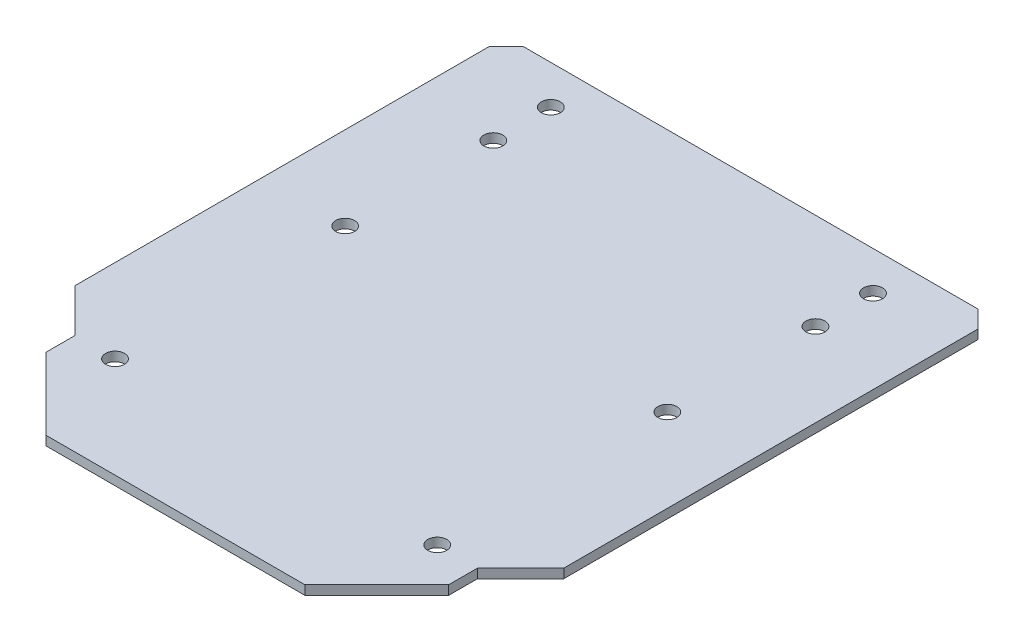
ISO-10303-21;
HEADER;
FILE_DESCRIPTION(('STEP AP214'),'2;1');
FILE_NAME('part.step','',(''),(''),'','','');
FILE_SCHEMA(('AUTOMOTIVE_DESIGN { 1 0 10303 214 1 1 1 1 }'));
ENDSEC;
DATA;
#1=APPLICATION_CONTEXT('core data for automotive mechanical design processes');
#2=APPLICATION_PROTOCOL_DEFINITION('international standard','automotive_design',2000,#1);
#3=PRODUCT_CONTEXT('',#1,'mechanical');
#4=PRODUCT('Part','Part','',(#3));
#5=PRODUCT_RELATED_PRODUCT_CATEGORY('part','',(#4));
#6=PRODUCT_DEFINITION_FORMATION('','',#4);
#7=PRODUCT_DEFINITION_CONTEXT('part definition',#1,'design');
#8=PRODUCT_DEFINITION('design','',#6,#7);
#9=PRODUCT_DEFINITION_SHAPE('','',#8);
#10=(LENGTH_UNIT() NAMED_UNIT(*) SI_UNIT(.MILLI.,.METRE.));
#11=(NAMED_UNIT(*) PLANE_ANGLE_UNIT() SI_UNIT($,.RADIAN.));
#12=(NAMED_UNIT(*) SI_UNIT($,.STERADIAN.) SOLID_ANGLE_UNIT());
#13=UNCERTAINTY_MEASURE_WITH_UNIT(LENGTH_MEASURE(1.E-05),#10,'distance_accuracy_value','');
#14=(GEOMETRIC_REPRESENTATION_CONTEXT(3) GLOBAL_UNCERTAINTY_ASSIGNED_CONTEXT((#13)) GLOBAL_UNIT_ASSIGNED_CONTEXT((#10,
#11,#12)) REPRESENTATION_CONTEXT('',''));
#15=CARTESIAN_POINT('',(0.,0.,0.));
#16=DIRECTION('',(0.,0.,1.));
#17=DIRECTION('',(1.,0.,0.));
#18=AXIS2_PLACEMENT_3D('',#15,#16,#17);
#19=CARTESIAN_POINT('',(42.5,1.6,37.5));
#20=DIRECTION('',(-1.,0.,0.));
#21=DIRECTION('',(0.,0.,1.));
#22=AXIS2_PLACEMENT_3D('',#19,#20,#21);
#23=PLANE('',#22);
#24=DIRECTION('',(0.,1.,0.));
#25=VECTOR('',#24,1.);
#26=CARTESIAN_POINT('',(42.5,-0.000999999999999916,12.4999999999999));
#27=LINE('',#26,#25);
#28=CARTESIAN_POINT('',(42.5,0.,12.4999999999999));
#29=VERTEX_POINT('',#28);
#30=CARTESIAN_POINT('',(42.5,1.6,12.4999999999999));
#31=VERTEX_POINT('',#30);
#32=EDGE_CURVE('E125',#29,#31,#27,.T.);
#33=ORIENTED_EDGE('',*,*,#32,.F.);
#34=DIRECTION('',(0.,0.,-1.));
#35=VECTOR('',#34,1.);
#36=CARTESIAN_POINT('',(42.5,0.,37.5));
#37=LINE('',#36,#35);
#38=CARTESIAN_POINT('',(42.5,0.,-59.5));
#39=VERTEX_POINT('',#38);
#40=EDGE_CURVE('E161',#29,#39,#37,.T.);
#41=ORIENTED_EDGE('',*,*,#40,.T.);
#42=DIRECTION('',(0.,1.,0.));
#43=VECTOR('',#42,1.);
#44=CARTESIAN_POINT('',(42.5,1.6,-59.5));
#45=LINE('',#44,#43);
#46=CARTESIAN_POINT('',(42.5,1.6,-59.5));
#47=VERTEX_POINT('',#46);
#48=EDGE_CURVE('E143',#39,#47,#45,.T.);
#49=ORIENTED_EDGE('',*,*,#48,.T.);
#50=DIRECTION('',(0.,0.,-1.));
#51=VECTOR('',#50,1.);
#52=CARTESIAN_POINT('',(42.5,1.6,37.5));
#53=LINE('',#52,#51);
#54=EDGE_CURVE('E138',#31,#47,#53,.T.);
#55=ORIENTED_EDGE('',*,*,#54,.F.);
#56=EDGE_LOOP('',(#33,#41,#49,#55));
#57=FACE_BOUND('',#56,.T.);
#58=ADVANCED_FACE('F35',(#57),#23,.F.);
#59=CARTESIAN_POINT('',(0.,1.6,0.));
#60=DIRECTION('',(0.,-1.,0.));
#61=DIRECTION('',(0.,0.,-1.));
#62=AXIS2_PLACEMENT_3D('',#59,#60,#61);
#63=PLANE('',#62);
#64=CARTESIAN_POINT('',(-28.,1.6,-45.75));
#65=DIRECTION('',(0.,1.,0.));
#66=DIRECTION('',(0.,0.,1.));
#67=AXIS2_PLACEMENT_3D('',#64,#65,#66);
#68=CIRCLE('',#67,1.65);
#69=CARTESIAN_POINT('',(-28.,1.6,-44.1));
#70=VERTEX_POINT('',#69);
#71=EDGE_CURVE('E383',#70,#70,#68,.T.);
#72=ORIENTED_EDGE('',*,*,#71,.F.);
#73=EDGE_LOOP('',(#72));
#74=FACE_BOUND('',#73,.T.);
#75=CARTESIAN_POINT('',(28.,1.6,-55.75));
#76=DIRECTION('',(0.,1.,0.));
#77=DIRECTION('',(0.,0.,1.));
#78=AXIS2_PLACEMENT_3D('',#75,#76,#77);
#79=CIRCLE('',#78,1.65);
#80=CARTESIAN_POINT('',(28.,1.6,-54.1));
#81=VERTEX_POINT('',#80);
#82=EDGE_CURVE('E379',#81,#81,#79,.T.);
#83=ORIENTED_EDGE('',*,*,#82,.F.);
#84=EDGE_LOOP('',(#83));
#85=FACE_BOUND('',#84,.T.);
#86=CARTESIAN_POINT('',(28.,1.6,-45.75));
#87=DIRECTION('',(0.,1.,0.));
#88=DIRECTION('',(0.,0.,1.));
#89=AXIS2_PLACEMENT_3D('',#86,#87,#88);
#90=CIRCLE('',#89,1.65);
#91=CARTESIAN_POINT('',(28.,1.6,-44.1));
#92=VERTEX_POINT('',#91);
#93=EDGE_CURVE('E376',#92,#92,#90,.T.);
#94=ORIENTED_EDGE('',*,*,#93,.F.);
#95=EDGE_LOOP('',(#94));
#96=FACE_BOUND('',#95,.T.);
#97=CARTESIAN_POINT('',(-28.,1.6,-55.75));
#98=DIRECTION('',(0.,1.,0.));
#99=DIRECTION('',(0.,0.,1.));
#100=AXIS2_PLACEMENT_3D('',#97,#98,#99);
#101=CIRCLE('',#100,1.65);
#102=CARTESIAN_POINT('',(-28.,1.6,-54.1));
#103=VERTEX_POINT('',#102);
#104=EDGE_CURVE('E389',#103,#103,#101,.T.);
#105=ORIENTED_EDGE('',*,*,#104,.F.);
#106=EDGE_LOOP('',(#105));
#107=FACE_BOUND('',#106,.T.);
#108=CARTESIAN_POINT('',(-28.,1.6,-20.));
#109=DIRECTION('',(0.,1.,0.));
#110=DIRECTION('',(0.,0.,1.));
#111=AXIS2_PLACEMENT_3D('',#108,#109,#110);
#112=CIRCLE('',#111,1.65);
#113=CARTESIAN_POINT('',(-28.,1.6,-18.35));
#114=VERTEX_POINT('',#113);
#115=EDGE_CURVE('E163',#114,#114,#112,.T.);
#116=ORIENTED_EDGE('',*,*,#115,.F.);
#117=EDGE_LOOP('',(#116));
#118=FACE_BOUND('',#117,.T.);
#119=CARTESIAN_POINT('',(28.,1.6,20.));
#120=DIRECTION('',(0.,1.,0.));
#121=DIRECTION('',(0.,0.,1.));
#122=AXIS2_PLACEMENT_3D('',#119,#120,#121);
#123=CIRCLE('',#122,1.65);
#124=CARTESIAN_POINT('',(28.,1.6,21.65));
#125=VERTEX_POINT('',#124);
#126=EDGE_CURVE('E238',#125,#125,#123,.T.);
#127=ORIENTED_EDGE('',*,*,#126,.F.);
#128=EDGE_LOOP('',(#127));
#129=FACE_BOUND('',#128,.T.);
#130=CARTESIAN_POINT('',(28.,1.6,-20.));
#131=DIRECTION('',(0.,1.,0.));
#132=DIRECTION('',(0.,0.,1.));
#133=AXIS2_PLACEMENT_3D('',#130,#131,#132);
#134=CIRCLE('',#133,1.65);
#135=CARTESIAN_POINT('',(28.,1.6,-18.35));
#136=VERTEX_POINT('',#135);
#137=EDGE_CURVE('E250',#136,#136,#134,.T.);
#138=ORIENTED_EDGE('',*,*,#137,.F.);
#139=EDGE_LOOP('',(#138));
#140=FACE_BOUND('',#139,.T.);
#141=CARTESIAN_POINT('',(-28.,1.6,20.));
#142=DIRECTION('',(0.,1.,0.));
#143=DIRECTION('',(0.,0.,1.));
#144=AXIS2_PLACEMENT_3D('',#141,#142,#143);
#145=CIRCLE('',#144,1.65);
#146=CARTESIAN_POINT('',(-28.,1.6,21.65));
#147=VERTEX_POINT('',#146);
#148=EDGE_CURVE('E244',#147,#147,#145,.T.);
#149=ORIENTED_EDGE('',*,*,#148,.F.);
#150=EDGE_LOOP('',(#149));
#151=FACE_BOUND('',#150,.T.);
#152=DIRECTION('',(0.,0.,-1.));
#153=VECTOR('',#152,1.);
#154=CARTESIAN_POINT('',(35.,1.6,24.9999999999999));
#155=LINE('',#154,#153);
#156=CARTESIAN_POINT('',(35.0000000000001,1.6,24.9999999999999));
#157=VERTEX_POINT('',#156);
#158=CARTESIAN_POINT('',(35.,1.6,19.9999999999999));
#159=VERTEX_POINT('',#158);
#160=EDGE_CURVE('E50',#157,#159,#155,.T.);
#161=ORIENTED_EDGE('',*,*,#160,.T.);
#162=DIRECTION('',(0.707106781186547,0.,-0.707106781186548));
#163=VECTOR('',#162,1.);
#164=CARTESIAN_POINT('',(35.,1.6,19.9999999999999));
#165=LINE('',#164,#163);
#166=EDGE_CURVE('E128',#159,#31,#165,.T.);
#167=ORIENTED_EDGE('',*,*,#166,.T.);
#168=ORIENTED_EDGE('',*,*,#54,.T.);
#169=DIRECTION('',(0.707106781186545,0.,0.70710678118655));
#170=VECTOR('',#169,1.);
#171=CARTESIAN_POINT('',(39.5,1.6,-62.5));
#172=LINE('',#171,#170);
#173=CARTESIAN_POINT('',(39.5,1.6,-62.5));
#174=VERTEX_POINT('',#173);
#175=EDGE_CURVE('E178',#47,#174,#172,.F.);
#176=ORIENTED_EDGE('',*,*,#175,.T.);
#177=DIRECTION('',(1.,0.,0.));
#178=VECTOR('',#177,1.);
#179=CARTESIAN_POINT('',(-42.5,1.6,-62.5));
#180=LINE('',#179,#178);
#181=CARTESIAN_POINT('',(-39.4999999999999,1.6,-62.5));
#182=VERTEX_POINT('',#181);
#183=EDGE_CURVE('E234',#182,#174,#180,.T.);
#184=ORIENTED_EDGE('',*,*,#183,.F.);
#185=DIRECTION('',(0.70710678118655,0.,-0.707106781186545));
#186=VECTOR('',#185,1.);
#187=CARTESIAN_POINT('',(-42.5,1.6,-59.5));
#188=LINE('',#187,#186);
#189=CARTESIAN_POINT('',(-42.5,1.6,-59.5));
#190=VERTEX_POINT('',#189);
#191=EDGE_CURVE('E176',#182,#190,#188,.F.);
#192=ORIENTED_EDGE('',*,*,#191,.T.);
#193=DIRECTION('',(0.,0.,1.));
#194=VECTOR('',#193,1.);
#195=CARTESIAN_POINT('',(-42.5,1.6,37.5));
#196=LINE('',#195,#194);
#197=CARTESIAN_POINT('',(-42.5,1.6,12.4999999999999));
#198=VERTEX_POINT('',#197);
#199=EDGE_CURVE('E145',#190,#198,#196,.T.);
#200=ORIENTED_EDGE('',*,*,#199,.T.);
#201=DIRECTION('',(-0.707106781186547,0.,-0.707106781186548));
#202=VECTOR('',#201,1.);
#203=CARTESIAN_POINT('',(-35.,1.6,19.9999999999999));
#204=LINE('',#203,#202);
#205=CARTESIAN_POINT('',(-35.,1.6,19.9999999999999));
#206=VERTEX_POINT('',#205);
#207=EDGE_CURVE('E222',#206,#198,#204,.T.);
#208=ORIENTED_EDGE('',*,*,#207,.F.);
#209=DIRECTION('',(0.,0.,-1.));
#210=VECTOR('',#209,1.);
#211=CARTESIAN_POINT('',(-35.,1.6,24.9999999999999));
#212=LINE('',#211,#210);
#213=CARTESIAN_POINT('',(-35.,1.6,24.9999999999999));
#214=VERTEX_POINT('',#213);
#215=EDGE_CURVE('E198',#214,#206,#212,.T.);
#216=ORIENTED_EDGE('',*,*,#215,.F.);
#217=DIRECTION('',(-0.707106781186547,0.,-0.707106781186548));
#218=VECTOR('',#217,1.);
#219=CARTESIAN_POINT('',(-22.5,1.6,37.5));
#220=LINE('',#219,#218);
#221=CARTESIAN_POINT('',(-22.5,1.6,37.5));
#222=VERTEX_POINT('',#221);
#223=EDGE_CURVE('E43',#214,#222,#220,.F.);
#224=ORIENTED_EDGE('',*,*,#223,.T.);
#225=DIRECTION('',(1.,0.,0.));
#226=VECTOR('',#225,1.);
#227=CARTESIAN_POINT('',(-42.5,1.6,37.5));
#228=LINE('',#227,#226);
#229=CARTESIAN_POINT('',(22.5,1.6,37.5));
#230=VERTEX_POINT('',#229);
#231=EDGE_CURVE('E149',#222,#230,#228,.T.);
#232=ORIENTED_EDGE('',*,*,#231,.T.);
#233=DIRECTION('',(-0.707106781186549,0.,0.707106781186547));
#234=VECTOR('',#233,1.);
#235=CARTESIAN_POINT('',(42.5,1.6,17.5));
#236=LINE('',#235,#234);
#237=EDGE_CURVE('E11',#230,#157,#236,.F.);
#238=ORIENTED_EDGE('',*,*,#237,.T.);
#239=EDGE_LOOP('',(#161,#167,#168,#176,#184,#192,#200,#208,#216,#224,#232,#238));
#240=FACE_BOUND('',#239,.T.);
#241=ADVANCED_FACE('F137',(#74,#85,#96,#107,#118,#129,#140,#151,#240),#63,.F.);
#242=CARTESIAN_POINT('',(0.,0.,0.));
#243=DIRECTION('',(0.,-1.,0.));
#244=DIRECTION('',(0.,0.,-1.));
#245=AXIS2_PLACEMENT_3D('',#242,#243,#244);
#246=PLANE('',#245);
#247=CARTESIAN_POINT('',(-28.,0.,-45.75));
#248=DIRECTION('',(0.,-1.,0.));
#249=DIRECTION('',(0.,0.,-1.));
#250=AXIS2_PLACEMENT_3D('',#247,#248,#249);
#251=CIRCLE('',#250,1.65);
#252=CARTESIAN_POINT('',(-28.,0.,-47.4));
#253=VERTEX_POINT('',#252);
#254=EDGE_CURVE('E306',#253,#253,#251,.F.);
#255=ORIENTED_EDGE('',*,*,#254,.T.);
#256=EDGE_LOOP('',(#255));
#257=FACE_BOUND('',#256,.T.);
#258=CARTESIAN_POINT('',(28.,0.,-55.75));
#259=DIRECTION('',(0.,-1.,0.));
#260=DIRECTION('',(0.,0.,-1.));
#261=AXIS2_PLACEMENT_3D('',#258,#259,#260);
#262=CIRCLE('',#261,1.65);
#263=CARTESIAN_POINT('',(28.,0.,-57.4));
#264=VERTEX_POINT('',#263);
#265=EDGE_CURVE('E310',#264,#264,#262,.F.);
#266=ORIENTED_EDGE('',*,*,#265,.T.);
#267=EDGE_LOOP('',(#266));
#268=FACE_BOUND('',#267,.T.);
#269=CARTESIAN_POINT('',(28.,0.,-45.75));
#270=DIRECTION('',(0.,-1.,0.));
#271=DIRECTION('',(0.,0.,-1.));
#272=AXIS2_PLACEMENT_3D('',#269,#270,#271);
#273=CIRCLE('',#272,1.65);
#274=CARTESIAN_POINT('',(28.,0.,-47.4));
#275=VERTEX_POINT('',#274);
#276=EDGE_CURVE('E314',#275,#275,#273,.F.);
#277=ORIENTED_EDGE('',*,*,#276,.T.);
#278=EDGE_LOOP('',(#277));
#279=FACE_BOUND('',#278,.T.);
#280=CARTESIAN_POINT('',(-28.,0.,-55.75));
#281=DIRECTION('',(0.,-1.,0.));
#282=DIRECTION('',(0.,0.,-1.));
#283=AXIS2_PLACEMENT_3D('',#280,#281,#282);
#284=CIRCLE('',#283,1.65);
#285=CARTESIAN_POINT('',(-28.,0.,-57.4));
#286=VERTEX_POINT('',#285);
#287=EDGE_CURVE('E318',#286,#286,#284,.F.);
#288=ORIENTED_EDGE('',*,*,#287,.T.);
#289=EDGE_LOOP('',(#288));
#290=FACE_BOUND('',#289,.T.);
#291=CARTESIAN_POINT('',(-28.,0.,20.));
#292=DIRECTION('',(0.,-1.,0.));
#293=DIRECTION('',(0.,0.,-1.));
#294=AXIS2_PLACEMENT_3D('',#291,#292,#293);
#295=CIRCLE('',#294,1.65);
#296=CARTESIAN_POINT('',(-28.,0.,18.35));
#297=VERTEX_POINT('',#296);
#298=EDGE_CURVE('E247',#297,#297,#295,.F.);
#299=ORIENTED_EDGE('',*,*,#298,.T.);
#300=EDGE_LOOP('',(#299));
#301=FACE_BOUND('',#300,.T.);
#302=CARTESIAN_POINT('',(28.,0.,-20.));
#303=DIRECTION('',(0.,-1.,0.));
#304=DIRECTION('',(0.,0.,-1.));
#305=AXIS2_PLACEMENT_3D('',#302,#303,#304);
#306=CIRCLE('',#305,1.65);
#307=CARTESIAN_POINT('',(28.,0.,-21.65));
#308=VERTEX_POINT('',#307);
#309=EDGE_CURVE('E241',#308,#308,#306,.F.);
#310=ORIENTED_EDGE('',*,*,#309,.T.);
#311=EDGE_LOOP('',(#310));
#312=FACE_BOUND('',#311,.T.);
#313=CARTESIAN_POINT('',(28.,0.,20.));
#314=DIRECTION('',(0.,-1.,0.));
#315=DIRECTION('',(0.,0.,-1.));
#316=AXIS2_PLACEMENT_3D('',#313,#314,#315);
#317=CIRCLE('',#316,1.65);
#318=CARTESIAN_POINT('',(28.,0.,18.35));
#319=VERTEX_POINT('',#318);
#320=EDGE_CURVE('E237',#319,#319,#317,.F.);
#321=ORIENTED_EDGE('',*,*,#320,.T.);
#322=EDGE_LOOP('',(#321));
#323=FACE_BOUND('',#322,.T.);
#324=CARTESIAN_POINT('',(-28.,0.,-20.));
#325=DIRECTION('',(0.,-1.,0.));
#326=DIRECTION('',(0.,0.,-1.));
#327=AXIS2_PLACEMENT_3D('',#324,#325,#326);
#328=CIRCLE('',#327,1.65);
#329=CARTESIAN_POINT('',(-28.,0.,-21.65));
#330=VERTEX_POINT('',#329);
#331=EDGE_CURVE('E155',#330,#330,#328,.F.);
#332=ORIENTED_EDGE('',*,*,#331,.T.);
#333=EDGE_LOOP('',(#332));
#334=FACE_BOUND('',#333,.T.);
#335=DIRECTION('',(0.707106781186547,0.,-0.707106781186548));
#336=VECTOR('',#335,1.);
#337=CARTESIAN_POINT('',(35.,0.,19.9999999999999));
#338=LINE('',#337,#336);
#339=CARTESIAN_POINT('',(35.,0.,19.9999999999999));
#340=VERTEX_POINT('',#339);
#341=EDGE_CURVE('E130',#340,#29,#338,.T.);
#342=ORIENTED_EDGE('',*,*,#341,.F.);
#343=DIRECTION('',(0.,0.,-1.));
#344=VECTOR('',#343,1.);
#345=CARTESIAN_POINT('',(35.,0.,24.9999999999999));
#346=LINE('',#345,#344);
#347=CARTESIAN_POINT('',(35.,0.,24.9999999999999));
#348=VERTEX_POINT('',#347);
#349=EDGE_CURVE('E140',#348,#340,#346,.T.);
#350=ORIENTED_EDGE('',*,*,#349,.F.);
#351=DIRECTION('',(0.707106781186549,0.,-0.707106781186547));
#352=VECTOR('',#351,1.);
#353=CARTESIAN_POINT('',(29.9999999999999,0.,30.));
#354=LINE('',#353,#352);
#355=CARTESIAN_POINT('',(22.5,0.,37.5));
#356=VERTEX_POINT('',#355);
#357=EDGE_CURVE('E186',#348,#356,#354,.F.);
#358=ORIENTED_EDGE('',*,*,#357,.T.);
#359=DIRECTION('',(1.,0.,0.));
#360=VECTOR('',#359,1.);
#361=CARTESIAN_POINT('',(-42.5,0.,37.5));
#362=LINE('',#361,#360);
#363=CARTESIAN_POINT('',(-22.5,0.,37.5));
#364=VERTEX_POINT('',#363);
#365=EDGE_CURVE('E146',#364,#356,#362,.T.);
#366=ORIENTED_EDGE('',*,*,#365,.F.);
#367=DIRECTION('',(0.707106781186547,0.,0.707106781186548));
#368=VECTOR('',#367,1.);
#369=CARTESIAN_POINT('',(-30.,0.,29.9999999999999));
#370=LINE('',#369,#368);
#371=CARTESIAN_POINT('',(-35.,0.,25.));
#372=VERTEX_POINT('',#371);
#373=EDGE_CURVE('E183',#364,#372,#370,.F.);
#374=ORIENTED_EDGE('',*,*,#373,.T.);
#375=DIRECTION('',(0.,0.,-1.));
#376=VECTOR('',#375,1.);
#377=CARTESIAN_POINT('',(-35.,0.,24.9999999999999));
#378=LINE('',#377,#376);
#379=CARTESIAN_POINT('',(-35.,0.,19.9999999999999));
#380=VERTEX_POINT('',#379);
#381=EDGE_CURVE('E58',#372,#380,#378,.T.);
#382=ORIENTED_EDGE('',*,*,#381,.T.);
#383=DIRECTION('',(-0.707106781186547,0.,-0.707106781186548));
#384=VECTOR('',#383,1.);
#385=CARTESIAN_POINT('',(-35.,0.,19.9999999999999));
#386=LINE('',#385,#384);
#387=CARTESIAN_POINT('',(-42.5,0.,12.4999999999999));
#388=VERTEX_POINT('',#387);
#389=EDGE_CURVE('E215',#380,#388,#386,.T.);
#390=ORIENTED_EDGE('',*,*,#389,.T.);
#391=DIRECTION('',(0.,0.,1.));
#392=VECTOR('',#391,1.);
#393=CARTESIAN_POINT('',(-42.5,0.,37.5));
#394=LINE('',#393,#392);
#395=CARTESIAN_POINT('',(-42.5,0.,-59.5));
#396=VERTEX_POINT('',#395);
#397=EDGE_CURVE('E152',#396,#388,#394,.T.);
#398=ORIENTED_EDGE('',*,*,#397,.F.);
#399=DIRECTION('',(-0.70710678118655,0.,0.707106781186545));
#400=VECTOR('',#399,1.);
#401=CARTESIAN_POINT('',(-50.9999999999998,0.,-51.0000000000002));
#402=LINE('',#401,#400);
#403=CARTESIAN_POINT('',(-39.4999999999999,0.,-62.5));
#404=VERTEX_POINT('',#403);
#405=EDGE_CURVE('E170',#396,#404,#402,.F.);
#406=ORIENTED_EDGE('',*,*,#405,.T.);
#407=DIRECTION('',(-1.,0.,0.));
#408=VECTOR('',#407,1.);
#409=CARTESIAN_POINT('',(-42.5,0.,-62.5));
#410=LINE('',#409,#408);
#411=CARTESIAN_POINT('',(39.5,0.,-62.5));
#412=VERTEX_POINT('',#411);
#413=EDGE_CURVE('E231',#412,#404,#410,.T.);
#414=ORIENTED_EDGE('',*,*,#413,.F.);
#415=DIRECTION('',(-0.707106781186545,0.,-0.70710678118655));
#416=VECTOR('',#415,1.);
#417=CARTESIAN_POINT('',(51.0000000000001,0.,-50.9999999999998));
#418=LINE('',#417,#416);
#419=EDGE_CURVE('E172',#412,#39,#418,.F.);
#420=ORIENTED_EDGE('',*,*,#419,.T.);
#421=ORIENTED_EDGE('',*,*,#40,.F.);
#422=EDGE_LOOP('',(#342,#350,#358,#366,#374,#382,#390,#398,#406,#414,#420,#421));
#423=FACE_BOUND('',#422,.T.);
#424=ADVANCED_FACE('F207',(#257,#268,#279,#290,#301,#312,#323,#334,#423),#246,.T.);
#425=CARTESIAN_POINT('',(42.5,1.6,17.5));
#426=DIRECTION('',(-0.707106781186547,0.,-0.707106781186549));
#427=DIRECTION('',(0.,-1.,0.));
#428=AXIS2_PLACEMENT_3D('',#425,#426,#427);
#429=PLANE('',#428);
#430=ORIENTED_EDGE('',*,*,#357,.F.);
#431=DIRECTION('',(0.,1.,0.));
#432=VECTOR('',#431,1.);
#433=CARTESIAN_POINT('',(35.,-0.000999999999999916,24.9999999999999));
#434=LINE('',#433,#432);
#435=EDGE_CURVE('E213',#348,#157,#434,.T.);
#436=ORIENTED_EDGE('',*,*,#435,.T.);
#437=ORIENTED_EDGE('',*,*,#237,.F.);
#438=DIRECTION('',(0.,1.,0.));
#439=VECTOR('',#438,1.);
#440=CARTESIAN_POINT('',(22.5,1.6,37.5));
#441=LINE('',#440,#439);
#442=EDGE_CURVE('E191',#356,#230,#441,.T.);
#443=ORIENTED_EDGE('',*,*,#442,.F.);
#444=EDGE_LOOP('',(#430,#436,#437,#443));
#445=FACE_BOUND('',#444,.T.);
#446=ADVANCED_FACE('F212',(#445),#429,.F.);
#447=CARTESIAN_POINT('',(-42.5,1.6,37.5));
#448=DIRECTION('',(1.,0.,0.));
#449=DIRECTION('',(0.,0.,-1.));
#450=AXIS2_PLACEMENT_3D('',#447,#448,#449);
#451=PLANE('',#450);
#452=ORIENTED_EDGE('',*,*,#397,.T.);
#453=DIRECTION('',(0.,1.,0.));
#454=VECTOR('',#453,1.);
#455=CARTESIAN_POINT('',(-42.5,-0.000999999999999916,12.4999999999999));
#456=LINE('',#455,#454);
#457=EDGE_CURVE('E224',#388,#198,#456,.T.);
#458=ORIENTED_EDGE('',*,*,#457,.T.);
#459=ORIENTED_EDGE('',*,*,#199,.F.);
#460=DIRECTION('',(0.,-1.,0.));
#461=VECTOR('',#460,1.);
#462=CARTESIAN_POINT('',(-42.5,1.6,-59.5));
#463=LINE('',#462,#461);
#464=EDGE_CURVE('E180',#190,#396,#463,.T.);
#465=ORIENTED_EDGE('',*,*,#464,.T.);
#466=EDGE_LOOP('',(#452,#458,#459,#465));
#467=FACE_BOUND('',#466,.T.);
#468=ADVANCED_FACE('F273',(#467),#451,.F.);
#469=CARTESIAN_POINT('',(-42.5,1.6,37.5));
#470=DIRECTION('',(0.,0.,-1.));
#471=DIRECTION('',(-1.,0.,0.));
#472=AXIS2_PLACEMENT_3D('',#469,#470,#471);
#473=PLANE('',#472);
#474=ORIENTED_EDGE('',*,*,#365,.T.);
#475=ORIENTED_EDGE('',*,*,#442,.T.);
#476=ORIENTED_EDGE('',*,*,#231,.F.);
#477=DIRECTION('',(0.,-1.,0.));
#478=VECTOR('',#477,1.);
#479=CARTESIAN_POINT('',(-22.5,1.6,37.5));
#480=LINE('',#479,#478);
#481=EDGE_CURVE('E188',#222,#364,#480,.T.);
#482=ORIENTED_EDGE('',*,*,#481,.T.);
#483=EDGE_LOOP('',(#474,#475,#476,#482));
#484=FACE_BOUND('',#483,.T.);
#485=ADVANCED_FACE('F202',(#484),#473,.F.);
#486=CARTESIAN_POINT('',(-28.,-0.000999999999999916,-20.));
#487=DIRECTION('',(0.,1.,0.));
#488=DIRECTION('',(0.,0.,1.));
#489=AXIS2_PLACEMENT_3D('',#486,#487,#488);
#490=CYLINDRICAL_SURFACE('',#489,1.65);
#491=ORIENTED_EDGE('',*,*,#331,.F.);
#492=EDGE_LOOP('',(#491));
#493=FACE_BOUND('',#492,.T.);
#494=ORIENTED_EDGE('',*,*,#115,.T.);
#495=EDGE_LOOP('',(#494));
#496=FACE_BOUND('',#495,.T.);
#497=ADVANCED_FACE('F261',(#493,#496),#490,.F.);
#498=CARTESIAN_POINT('',(28.,-0.000999999999999916,20.));
#499=DIRECTION('',(0.,1.,0.));
#500=DIRECTION('',(0.,0.,1.));
#501=AXIS2_PLACEMENT_3D('',#498,#499,#500);
#502=CYLINDRICAL_SURFACE('',#501,1.65);
#503=ORIENTED_EDGE('',*,*,#320,.F.);
#504=EDGE_LOOP('',(#503));
#505=FACE_BOUND('',#504,.T.);
#506=ORIENTED_EDGE('',*,*,#126,.T.);
#507=EDGE_LOOP('',(#506));
#508=FACE_BOUND('',#507,.T.);
#509=ADVANCED_FACE('F263',(#505,#508),#502,.F.);
#510=CARTESIAN_POINT('',(28.,-0.000999999999999916,-20.));
#511=DIRECTION('',(0.,1.,0.));
#512=DIRECTION('',(0.,0.,1.));
#513=AXIS2_PLACEMENT_3D('',#510,#511,#512);
#514=CYLINDRICAL_SURFACE('',#513,1.65);
#515=ORIENTED_EDGE('',*,*,#309,.F.);
#516=EDGE_LOOP('',(#515));
#517=FACE_BOUND('',#516,.T.);
#518=ORIENTED_EDGE('',*,*,#137,.T.);
#519=EDGE_LOOP('',(#518));
#520=FACE_BOUND('',#519,.T.);
#521=ADVANCED_FACE('F269',(#517,#520),#514,.F.);
#522=CARTESIAN_POINT('',(-28.,-0.000999999999999916,20.));
#523=DIRECTION('',(0.,1.,0.));
#524=DIRECTION('',(0.,0.,1.));
#525=AXIS2_PLACEMENT_3D('',#522,#523,#524);
#526=CYLINDRICAL_SURFACE('',#525,1.65);
#527=ORIENTED_EDGE('',*,*,#298,.F.);
#528=EDGE_LOOP('',(#527));
#529=FACE_BOUND('',#528,.T.);
#530=ORIENTED_EDGE('',*,*,#148,.T.);
#531=EDGE_LOOP('',(#530));
#532=FACE_BOUND('',#531,.T.);
#533=ADVANCED_FACE('F332',(#529,#532),#526,.F.);
#534=CARTESIAN_POINT('',(-42.5,90.2002257333468,-62.5));
#535=DIRECTION('',(0.,0.,1.));
#536=DIRECTION('',(1.,0.,0.));
#537=AXIS2_PLACEMENT_3D('',#534,#535,#536);
#538=PLANE('',#537);
#539=ORIENTED_EDGE('',*,*,#183,.T.);
#540=DIRECTION('',(0.,-1.,0.));
#541=VECTOR('',#540,1.);
#542=CARTESIAN_POINT('',(39.5,90.2002257333468,-62.5));
#543=LINE('',#542,#541);
#544=EDGE_CURVE('E167',#174,#412,#543,.T.);
#545=ORIENTED_EDGE('',*,*,#544,.T.);
#546=ORIENTED_EDGE('',*,*,#413,.T.);
#547=DIRECTION('',(0.,1.,0.));
#548=VECTOR('',#547,1.);
#549=CARTESIAN_POINT('',(-39.4999999999999,90.2002257333468,-62.5));
#550=LINE('',#549,#548);
#551=EDGE_CURVE('E160',#404,#182,#550,.T.);
#552=ORIENTED_EDGE('',*,*,#551,.T.);
#553=EDGE_LOOP('',(#539,#545,#546,#552));
#554=FACE_BOUND('',#553,.T.);
#555=ADVANCED_FACE('F290',(#554),#538,.F.);
#556=CARTESIAN_POINT('',(39.5,90.2002257333468,-62.5));
#557=DIRECTION('',(-0.70710678118655,0.,0.707106781186545));
#558=DIRECTION('',(0.,-1.,0.));
#559=AXIS2_PLACEMENT_3D('',#556,#557,#558);
#560=PLANE('',#559);
#561=ORIENTED_EDGE('',*,*,#175,.F.);
#562=ORIENTED_EDGE('',*,*,#48,.F.);
#563=ORIENTED_EDGE('',*,*,#419,.F.);
#564=ORIENTED_EDGE('',*,*,#544,.F.);
#565=EDGE_LOOP('',(#561,#562,#563,#564));
#566=FACE_BOUND('',#565,.T.);
#567=ADVANCED_FACE('F286',(#566),#560,.F.);
#568=CARTESIAN_POINT('',(-42.5,1.6,-59.5));
#569=DIRECTION('',(0.707106781186545,0.,0.70710678118655));
#570=DIRECTION('',(0.,-1.,0.));
#571=AXIS2_PLACEMENT_3D('',#568,#569,#570);
#572=PLANE('',#571);
#573=ORIENTED_EDGE('',*,*,#191,.F.);
#574=ORIENTED_EDGE('',*,*,#551,.F.);
#575=ORIENTED_EDGE('',*,*,#405,.F.);
#576=ORIENTED_EDGE('',*,*,#464,.F.);
#577=EDGE_LOOP('',(#573,#574,#575,#576));
#578=FACE_BOUND('',#577,.T.);
#579=ADVANCED_FACE('F289',(#578),#572,.F.);
#580=CARTESIAN_POINT('',(-22.5,1.6,37.5));
#581=DIRECTION('',(0.707106781186548,0.,-0.707106781186547));
#582=DIRECTION('',(0.,-1.,0.));
#583=AXIS2_PLACEMENT_3D('',#580,#581,#582);
#584=PLANE('',#583);
#585=DIRECTION('',(0.,1.,0.));
#586=VECTOR('',#585,1.);
#587=CARTESIAN_POINT('',(-35.,-0.000999999999999916,24.9999999999999));
#588=LINE('',#587,#586);
#589=EDGE_CURVE('E205',#372,#214,#588,.T.);
#590=ORIENTED_EDGE('',*,*,#589,.F.);
#591=ORIENTED_EDGE('',*,*,#373,.F.);
#592=ORIENTED_EDGE('',*,*,#481,.F.);
#593=ORIENTED_EDGE('',*,*,#223,.F.);
#594=EDGE_LOOP('',(#590,#591,#592,#593));
#595=FACE_BOUND('',#594,.T.);
#596=ADVANCED_FACE('F37',(#595),#584,.F.);
#597=CARTESIAN_POINT('',(-35.,-0.000999999999999916,19.9999999999999));
#598=DIRECTION('',(0.707106781186548,0.,-0.707106781186547));
#599=DIRECTION('',(-0.707106781186547,0.,-0.707106781186548));
#600=AXIS2_PLACEMENT_3D('',#597,#598,#599);
#601=PLANE('',#600);
#602=DIRECTION('',(0.,1.,0.));
#603=VECTOR('',#602,1.);
#604=CARTESIAN_POINT('',(-35.,-0.000999999999999916,19.9999999999999));
#605=LINE('',#604,#603);
#606=EDGE_CURVE('E227',#380,#206,#605,.T.);
#607=ORIENTED_EDGE('',*,*,#606,.T.);
#608=ORIENTED_EDGE('',*,*,#207,.T.);
#609=ORIENTED_EDGE('',*,*,#457,.F.);
#610=ORIENTED_EDGE('',*,*,#389,.F.);
#611=EDGE_LOOP('',(#607,#608,#609,#610));
#612=FACE_BOUND('',#611,.T.);
#613=ADVANCED_FACE('F348',(#612),#601,.F.);
#614=CARTESIAN_POINT('',(-35.,-0.000999999999999916,24.9999999999999));
#615=DIRECTION('',(1.,0.,0.));
#616=DIRECTION('',(0.,0.,-1.));
#617=AXIS2_PLACEMENT_3D('',#614,#615,#616);
#618=PLANE('',#617);
#619=ORIENTED_EDGE('',*,*,#589,.T.);
#620=ORIENTED_EDGE('',*,*,#215,.T.);
#621=ORIENTED_EDGE('',*,*,#606,.F.);
#622=ORIENTED_EDGE('',*,*,#381,.F.);
#623=EDGE_LOOP('',(#619,#620,#621,#622));
#624=FACE_BOUND('',#623,.T.);
#625=ADVANCED_FACE('F344',(#624),#618,.F.);
#626=CARTESIAN_POINT('',(35.,-0.000999999999999916,24.9999999999999));
#627=DIRECTION('',(1.,0.,0.));
#628=DIRECTION('',(0.,0.,-1.));
#629=AXIS2_PLACEMENT_3D('',#626,#627,#628);
#630=PLANE('',#629);
#631=ORIENTED_EDGE('',*,*,#349,.T.);
#632=DIRECTION('',(0.,1.,0.));
#633=VECTOR('',#632,1.);
#634=CARTESIAN_POINT('',(35.,-0.000999999999999916,19.9999999999999));
#635=LINE('',#634,#633);
#636=EDGE_CURVE('E134',#340,#159,#635,.T.);
#637=ORIENTED_EDGE('',*,*,#636,.T.);
#638=ORIENTED_EDGE('',*,*,#160,.F.);
#639=ORIENTED_EDGE('',*,*,#435,.F.);
#640=EDGE_LOOP('',(#631,#637,#638,#639));
#641=FACE_BOUND('',#640,.T.);
#642=ADVANCED_FACE('F347',(#641),#630,.T.);
#643=CARTESIAN_POINT('',(35.,-0.000999999999999916,19.9999999999999));
#644=DIRECTION('',(0.707106781186548,0.,0.707106781186547));
#645=DIRECTION('',(0.707106781186547,0.,-0.707106781186548));
#646=AXIS2_PLACEMENT_3D('',#643,#644,#645);
#647=PLANE('',#646);
#648=ORIENTED_EDGE('',*,*,#341,.T.);
#649=ORIENTED_EDGE('',*,*,#32,.T.);
#650=ORIENTED_EDGE('',*,*,#166,.F.);
#651=ORIENTED_EDGE('',*,*,#636,.F.);
#652=EDGE_LOOP('',(#648,#649,#650,#651));
#653=FACE_BOUND('',#652,.T.);
#654=ADVANCED_FACE('F127',(#653),#647,.T.);
#655=CARTESIAN_POINT('',(-28.,-0.000999999999999916,-55.75));
#656=DIRECTION('',(0.,1.,0.));
#657=DIRECTION('',(0.,0.,1.));
#658=AXIS2_PLACEMENT_3D('',#655,#656,#657);
#659=CYLINDRICAL_SURFACE('',#658,1.65);
#660=ORIENTED_EDGE('',*,*,#287,.F.);
#661=EDGE_LOOP('',(#660));
#662=FACE_BOUND('',#661,.T.);
#663=ORIENTED_EDGE('',*,*,#104,.T.);
#664=EDGE_LOOP('',(#663));
#665=FACE_BOUND('',#664,.T.);
#666=ADVANCED_FACE('F354',(#662,#665),#659,.F.);
#667=CARTESIAN_POINT('',(28.,-0.000999999999999916,-45.75));
#668=DIRECTION('',(0.,1.,0.));
#669=DIRECTION('',(0.,0.,1.));
#670=AXIS2_PLACEMENT_3D('',#667,#668,#669);
#671=CYLINDRICAL_SURFACE('',#670,1.65);
#672=ORIENTED_EDGE('',*,*,#276,.F.);
#673=EDGE_LOOP('',(#672));
#674=FACE_BOUND('',#673,.T.);
#675=ORIENTED_EDGE('',*,*,#93,.T.);
#676=EDGE_LOOP('',(#675));
#677=FACE_BOUND('',#676,.T.);
#678=ADVANCED_FACE('F359',(#674,#677),#671,.F.);
#679=CARTESIAN_POINT('',(28.,-0.000999999999999916,-55.75));
#680=DIRECTION('',(0.,1.,0.));
#681=DIRECTION('',(0.,0.,1.));
#682=AXIS2_PLACEMENT_3D('',#679,#680,#681);
#683=CYLINDRICAL_SURFACE('',#682,1.65);
#684=ORIENTED_EDGE('',*,*,#265,.F.);
#685=EDGE_LOOP('',(#684));
#686=FACE_BOUND('',#685,.T.);
#687=ORIENTED_EDGE('',*,*,#82,.T.);
#688=EDGE_LOOP('',(#687));
#689=FACE_BOUND('',#688,.T.);
#690=ADVANCED_FACE('F361',(#686,#689),#683,.F.);
#691=CARTESIAN_POINT('',(-28.,-0.000999999999999916,-45.75));
#692=DIRECTION('',(0.,1.,0.));
#693=DIRECTION('',(0.,0.,1.));
#694=AXIS2_PLACEMENT_3D('',#691,#692,#693);
#695=CYLINDRICAL_SURFACE('',#694,1.65);
#696=ORIENTED_EDGE('',*,*,#254,.F.);
#697=EDGE_LOOP('',(#696));
#698=FACE_BOUND('',#697,.T.);
#699=ORIENTED_EDGE('',*,*,#71,.T.);
#700=EDGE_LOOP('',(#699));
#701=FACE_BOUND('',#700,.T.);
#702=ADVANCED_FACE('F364',(#698,#701),#695,.F.);
#703=CLOSED_SHELL('',(#58,#241,#424,#446,#468,#485,#497,#509,#521,#533,#555,#567,#579,#596,#613,
#625,#642,#654,#666,#678,#690,#702));
#704=MANIFOLD_SOLID_BREP('B2',#703);
#705=ADVANCED_BREP_SHAPE_REPRESENTATION('',(#18,#704),#14);
#706=SHAPE_DEFINITION_REPRESENTATION(#9,#705);
ENDSEC;
END-ISO-10303-21;
